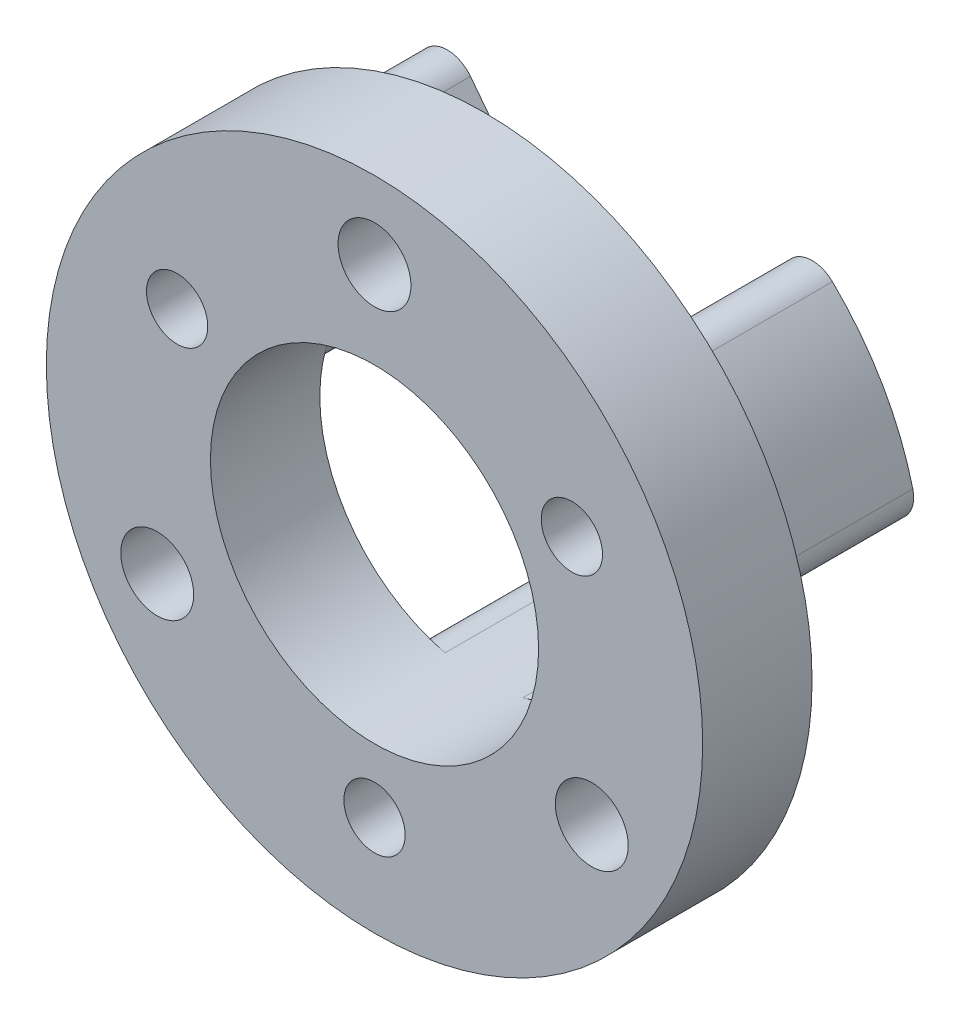
ISO-10303-21;
HEADER;
FILE_DESCRIPTION(('STEP AP214'),'2;1');
FILE_NAME('part.step','',(''),(''),'','','');
FILE_SCHEMA(('AUTOMOTIVE_DESIGN { 1 0 10303 214 1 1 1 1 }'));
ENDSEC;
DATA;
#1=APPLICATION_CONTEXT('core data for automotive mechanical design processes');
#2=APPLICATION_PROTOCOL_DEFINITION('international standard','automotive_design',2000,#1);
#3=PRODUCT_CONTEXT('',#1,'mechanical');
#4=PRODUCT('Part','Part','',(#3));
#5=PRODUCT_RELATED_PRODUCT_CATEGORY('part','',(#4));
#6=PRODUCT_DEFINITION_FORMATION('','',#4);
#7=PRODUCT_DEFINITION_CONTEXT('part definition',#1,'design');
#8=PRODUCT_DEFINITION('design','',#6,#7);
#9=PRODUCT_DEFINITION_SHAPE('','',#8);
#10=(LENGTH_UNIT() NAMED_UNIT(*) SI_UNIT(.MILLI.,.METRE.));
#11=(NAMED_UNIT(*) PLANE_ANGLE_UNIT() SI_UNIT($,.RADIAN.));
#12=(NAMED_UNIT(*) SI_UNIT($,.STERADIAN.) SOLID_ANGLE_UNIT());
#13=UNCERTAINTY_MEASURE_WITH_UNIT(LENGTH_MEASURE(1.E-05),#10,'distance_accuracy_value','');
#14=(GEOMETRIC_REPRESENTATION_CONTEXT(3) GLOBAL_UNCERTAINTY_ASSIGNED_CONTEXT((#13)) GLOBAL_UNIT_ASSIGNED_CONTEXT((#10,
#11,#12)) REPRESENTATION_CONTEXT('',''));
#15=CARTESIAN_POINT('',(0.,0.,0.));
#16=DIRECTION('',(0.,0.,1.));
#17=DIRECTION('',(1.,0.,0.));
#18=AXIS2_PLACEMENT_3D('',#15,#16,#17);
#19=CARTESIAN_POINT('',(0.,0.,10.));
#20=DIRECTION('',(0.,0.,1.));
#21=DIRECTION('',(1.,0.,0.));
#22=AXIS2_PLACEMENT_3D('',#19,#20,#21);
#23=PLANE('',#22);
#24=CARTESIAN_POINT('',(0.,0.,10.));
#25=DIRECTION('',(0.,0.,1.));
#26=DIRECTION('',(1.,0.,0.));
#27=AXIS2_PLACEMENT_3D('',#24,#25,#26);
#28=CIRCLE('',#27,22.5);
#29=CARTESIAN_POINT('',(22.5,0.,10.));
#30=VERTEX_POINT('',#29);
#31=EDGE_CURVE('E441',#30,#30,#28,.T.);
#32=ORIENTED_EDGE('',*,*,#31,.F.);
#33=EDGE_LOOP('',(#32));
#34=FACE_BOUND('',#33,.T.);
#35=CARTESIAN_POINT('',(0.,17.2,10.));
#36=DIRECTION('',(0.,0.,1.));
#37=DIRECTION('',(1.,0.,0.));
#38=AXIS2_PLACEMENT_3D('',#35,#36,#37);
#39=CIRCLE('',#38,2.5);
#40=CARTESIAN_POINT('',(2.5,17.2,10.));
#41=VERTEX_POINT('',#40);
#42=EDGE_CURVE('E429',#41,#41,#39,.T.);
#43=ORIENTED_EDGE('',*,*,#42,.T.);
#44=EDGE_LOOP('',(#43));
#45=FACE_BOUND('',#44,.T.);
#46=CARTESIAN_POINT('',(14.8956369450924,-8.6,10.));
#47=DIRECTION('',(0.,0.,1.));
#48=DIRECTION('',(1.,0.,0.));
#49=AXIS2_PLACEMENT_3D('',#46,#47,#48);
#50=CIRCLE('',#49,2.5);
#51=CARTESIAN_POINT('',(17.3956369450923,-8.6,10.));
#52=VERTEX_POINT('',#51);
#53=EDGE_CURVE('E423',#52,#52,#50,.T.);
#54=ORIENTED_EDGE('',*,*,#53,.T.);
#55=EDGE_LOOP('',(#54));
#56=FACE_BOUND('',#55,.T.);
#57=CARTESIAN_POINT('',(-14.8956369450923,-8.60000000000001,10.));
#58=DIRECTION('',(0.,0.,1.));
#59=DIRECTION('',(1.,0.,0.));
#60=AXIS2_PLACEMENT_3D('',#57,#58,#59);
#61=CIRCLE('',#60,2.5);
#62=CARTESIAN_POINT('',(-12.3956369450923,-8.60000000000001,10.));
#63=VERTEX_POINT('',#62);
#64=EDGE_CURVE('E419',#63,#63,#61,.T.);
#65=ORIENTED_EDGE('',*,*,#64,.T.);
#66=EDGE_LOOP('',(#65));
#67=FACE_BOUND('',#66,.T.);
#68=CARTESIAN_POINT('',(0.,0.,10.));
#69=DIRECTION('',(0.,0.,1.));
#70=DIRECTION('',(1.,0.,0.));
#71=AXIS2_PLACEMENT_3D('',#68,#69,#70);
#72=CIRCLE('',#71,11.25);
#73=CARTESIAN_POINT('',(-10.7975481057904,3.15839435522886,10.));
#74=VERTEX_POINT('',#73);
#75=CARTESIAN_POINT('',(-2.6635243060975,-10.9301481358135,10.));
#76=VERTEX_POINT('',#75);
#77=EDGE_CURVE('E444',#74,#76,#72,.T.);
#78=ORIENTED_EDGE('',*,*,#77,.T.);
#79=CARTESIAN_POINT('',(-3.13703973829261,-12.8732855821804,10.));
#80=DIRECTION('',(0.,0.,1.));
#81=DIRECTION('',(1.,0.,0.));
#82=AXIS2_PLACEMENT_3D('',#79,#80,#81);
#83=CIRCLE('',#82,2.);
#84=CARTESIAN_POINT('',(-4.98643947984107,-12.11189173143,10.));
#85=VERTEX_POINT('',#84);
#86=EDGE_CURVE('E12',#76,#85,#83,.T.);
#87=ORIENTED_EDGE('',*,*,#86,.T.);
#88=DIRECTION('',(-0.380696925375188,-0.924699870774231,0.));
#89=VECTOR('',#88,1.);
#90=CARTESIAN_POINT('',(0.,0.,10.));
#91=LINE('',#90,#89);
#92=CARTESIAN_POINT('',(-6.81011363171268,-16.5415341586916,10.));
#93=VERTEX_POINT('',#92);
#94=EDGE_CURVE('E358',#85,#93,#91,.T.);
#95=ORIENTED_EDGE('',*,*,#94,.T.);
#96=CARTESIAN_POINT('',(-4.96071389016422,-17.302928009442,10.));
#97=DIRECTION('',(0.,0.,1.));
#98=DIRECTION('',(1.,0.,0.));
#99=AXIS2_PLACEMENT_3D('',#96,#97,#98);
#100=CIRCLE('',#99,2.);
#101=CARTESIAN_POINT('',(-5.51190432240469,-19.2254755660466,10.));
#102=VERTEX_POINT('',#101);
#103=EDGE_CURVE('E73',#93,#102,#100,.T.);
#104=ORIENTED_EDGE('',*,*,#103,.T.);
#105=CARTESIAN_POINT('',(0.,0.,10.));
#106=DIRECTION('',(0.,0.,1.));
#107=DIRECTION('',(-0.499999999999992,-0.866025403784443,0.));
#108=AXIS2_PLACEMENT_3D('',#105,#106,#107);
#109=CIRCLE('',#108,20.);
#110=CARTESIAN_POINT('',(5.51190432240505,-19.2254755660465,10.));
#111=VERTEX_POINT('',#110);
#112=EDGE_CURVE('E356',#102,#111,#109,.T.);
#113=ORIENTED_EDGE('',*,*,#112,.T.);
#114=CARTESIAN_POINT('',(4.96071389016454,-17.3029280094419,10.));
#115=DIRECTION('',(0.,0.,1.));
#116=DIRECTION('',(1.,0.,0.));
#117=AXIS2_PLACEMENT_3D('',#114,#115,#116);
#118=CIRCLE('',#117,2.);
#119=CARTESIAN_POINT('',(6.81011363171299,-16.5415341586915,10.));
#120=VERTEX_POINT('',#119);
#121=EDGE_CURVE('E346',#111,#120,#118,.T.);
#122=ORIENTED_EDGE('',*,*,#121,.T.);
#123=DIRECTION('',(0.380696925375205,-0.924699870774223,0.));
#124=VECTOR('',#123,1.);
#125=CARTESIAN_POINT('',(0.,0.,10.));
#126=LINE('',#125,#124);
#127=CARTESIAN_POINT('',(4.9864394798413,-12.1118917314299,10.));
#128=VERTEX_POINT('',#127);
#129=EDGE_CURVE('E367',#128,#120,#126,.T.);
#130=ORIENTED_EDGE('',*,*,#129,.F.);
#131=CARTESIAN_POINT('',(3.13703973829285,-12.8732855821803,10.));
#132=DIRECTION('',(0.,0.,1.));
#133=DIRECTION('',(1.,0.,0.));
#134=AXIS2_PLACEMENT_3D('',#131,#132,#133);
#135=CIRCLE('',#134,2.);
#136=CARTESIAN_POINT('',(2.6635243060977,-10.9301481358135,10.));
#137=VERTEX_POINT('',#136);
#138=EDGE_CURVE('E349',#128,#137,#135,.T.);
#139=ORIENTED_EDGE('',*,*,#138,.T.);
#140=CARTESIAN_POINT('',(10.7975481057904,3.15839435522891,10.));
#141=VERTEX_POINT('',#140);
#142=EDGE_CURVE('E435',#137,#141,#72,.T.);
#143=ORIENTED_EDGE('',*,*,#142,.T.);
#144=CARTESIAN_POINT('',(12.7171122134865,3.71988668504738,10.));
#145=DIRECTION('',(0.,0.,1.));
#146=DIRECTION('',(1.,0.,0.));
#147=AXIS2_PLACEMENT_3D('',#144,#145,#146);
#148=CIRCLE('',#147,2.);
#149=CARTESIAN_POINT('',(12.9824256672256,1.73756260173884,10.));
#150=VERTEX_POINT('',#149);
#151=EDGE_CURVE('E255',#141,#150,#148,.T.);
#152=ORIENTED_EDGE('',*,*,#151,.T.);
#153=DIRECTION('',(0.991162041654266,0.132656726869564,0.));
#154=VECTOR('',#153,1.);
#155=CARTESIAN_POINT('',(0.,0.,10.));
#156=LINE('',#155,#154);
#157=CARTESIAN_POINT('',(17.7304456148513,2.37303567162375,10.));
#158=VERTEX_POINT('',#157);
#159=EDGE_CURVE('E251',#150,#158,#156,.T.);
#160=ORIENTED_EDGE('',*,*,#159,.T.);
#161=CARTESIAN_POINT('',(17.4651321611122,4.35535975493229,10.));
#162=DIRECTION('',(0.,0.,1.));
#163=DIRECTION('',(1.,0.,0.));
#164=AXIS2_PLACEMENT_3D('',#161,#162,#163);
#165=CIRCLE('',#164,2.);
#166=CARTESIAN_POINT('',(19.4057024012358,4.83928861659143,10.));
#167=VERTEX_POINT('',#166);
#168=EDGE_CURVE('E235',#158,#167,#165,.T.);
#169=ORIENTED_EDGE('',*,*,#168,.T.);
#170=CARTESIAN_POINT('',(0.,0.,10.));
#171=DIRECTION('',(0.,0.,1.));
#172=DIRECTION('',(1.,0.,0.));
#173=AXIS2_PLACEMENT_3D('',#170,#171,#172);
#174=CIRCLE('',#173,20.);
#175=CARTESIAN_POINT('',(13.8937980788309,14.3861869494552,10.));
#176=VERTEX_POINT('',#175);
#177=EDGE_CURVE('E245',#167,#176,#174,.T.);
#178=ORIENTED_EDGE('',*,*,#177,.T.);
#179=CARTESIAN_POINT('',(12.5044182709478,12.9475682545096,10.));
#180=DIRECTION('',(0.,0.,1.));
#181=DIRECTION('',(1.,0.,0.));
#182=AXIS2_PLACEMENT_3D('',#179,#180,#181);
#183=CIRCLE('',#182,2.);
#184=CARTESIAN_POINT('',(10.9203319831385,14.1684984870678,10.));
#185=VERTEX_POINT('',#184);
#186=EDGE_CURVE('E258',#176,#185,#183,.T.);
#187=ORIENTED_EDGE('',*,*,#186,.T.);
#188=DIRECTION('',(0.61046511627907,0.792043143904662,0.));
#189=VECTOR('',#188,1.);
#190=CARTESIAN_POINT('',(0.,0.,10.));
#191=LINE('',#190,#189);
#192=CARTESIAN_POINT('',(7.99598618738443,10.3743291296911,10.));
#193=VERTEX_POINT('',#192);
#194=EDGE_CURVE('E250',#193,#185,#191,.T.);
#195=ORIENTED_EDGE('',*,*,#194,.F.);
#196=CARTESIAN_POINT('',(9.58007247519376,9.15339889713296,10.));
#197=DIRECTION('',(0.,0.,1.));
#198=DIRECTION('',(1.,0.,0.));
#199=AXIS2_PLACEMENT_3D('',#196,#197,#198);
#200=CIRCLE('',#199,2.);
#201=CARTESIAN_POINT('',(8.13402379969281,7.77175378058459,10.));
#202=VERTEX_POINT('',#201);
#203=EDGE_CURVE('E254',#193,#202,#200,.T.);
#204=ORIENTED_EDGE('',*,*,#203,.T.);
#205=CARTESIAN_POINT('',(-8.13402379969285,7.77175378058455,10.));
#206=VERTEX_POINT('',#205);
#207=EDGE_CURVE('E442',#202,#206,#72,.T.);
#208=ORIENTED_EDGE('',*,*,#207,.T.);
#209=CARTESIAN_POINT('',(-9.5800724751938,9.15339889713292,10.));
#210=DIRECTION('',(0.,0.,1.));
#211=DIRECTION('',(1.,0.,0.));
#212=AXIS2_PLACEMENT_3D('',#209,#210,#211);
#213=CIRCLE('',#212,2.);
#214=CARTESIAN_POINT('',(-7.99598618738448,10.3743291296911,10.));
#215=VERTEX_POINT('',#214);
#216=EDGE_CURVE('E311',#206,#215,#213,.T.);
#217=ORIENTED_EDGE('',*,*,#216,.T.);
#218=DIRECTION('',(-0.610465116279074,0.79204314390466,0.));
#219=VECTOR('',#218,1.);
#220=CARTESIAN_POINT('',(0.,0.,10.));
#221=LINE('',#220,#219);
#222=CARTESIAN_POINT('',(-10.9203319831386,14.1684984870677,10.));
#223=VERTEX_POINT('',#222);
#224=EDGE_CURVE('E392',#215,#223,#221,.T.);
#225=ORIENTED_EDGE('',*,*,#224,.T.);
#226=CARTESIAN_POINT('',(-12.5044182709479,12.9475682545096,10.));
#227=DIRECTION('',(0.,0.,1.));
#228=DIRECTION('',(1.,0.,0.));
#229=AXIS2_PLACEMENT_3D('',#226,#227,#228);
#230=CIRCLE('',#229,2.);
#231=CARTESIAN_POINT('',(-13.893798078831,14.3861869494551,10.));
#232=VERTEX_POINT('',#231);
#233=EDGE_CURVE('E309',#223,#232,#230,.T.);
#234=ORIENTED_EDGE('',*,*,#233,.T.);
#235=CARTESIAN_POINT('',(0.,0.,10.));
#236=DIRECTION('',(0.,0.,1.));
#237=DIRECTION('',(-0.500000000000004,0.866025403784436,0.));
#238=AXIS2_PLACEMENT_3D('',#235,#236,#237);
#239=CIRCLE('',#238,20.);
#240=CARTESIAN_POINT('',(-19.4057024012358,4.83928861659134,10.));
#241=VERTEX_POINT('',#240);
#242=EDGE_CURVE('E395',#232,#241,#239,.T.);
#243=ORIENTED_EDGE('',*,*,#242,.T.);
#244=CARTESIAN_POINT('',(-17.4651321611122,4.35535975493221,10.));
#245=DIRECTION('',(0.,0.,1.));
#246=DIRECTION('',(1.,0.,0.));
#247=AXIS2_PLACEMENT_3D('',#244,#245,#246);
#248=CIRCLE('',#247,2.);
#249=CARTESIAN_POINT('',(-17.7304456148514,2.37303567162367,10.));
#250=VERTEX_POINT('',#249);
#251=EDGE_CURVE('E304',#241,#250,#248,.T.);
#252=ORIENTED_EDGE('',*,*,#251,.T.);
#253=DIRECTION('',(-0.991162041654267,0.13265672686956,0.));
#254=VECTOR('',#253,1.);
#255=CARTESIAN_POINT('',(0.,0.,10.));
#256=LINE('',#255,#254);
#257=CARTESIAN_POINT('',(-12.9824256672256,1.73756260173879,10.));
#258=VERTEX_POINT('',#257);
#259=EDGE_CURVE('E399',#258,#250,#256,.T.);
#260=ORIENTED_EDGE('',*,*,#259,.F.);
#261=CARTESIAN_POINT('',(-12.7171122134865,3.71988668504732,10.));
#262=DIRECTION('',(0.,0.,1.));
#263=DIRECTION('',(1.,0.,0.));
#264=AXIS2_PLACEMENT_3D('',#261,#262,#263);
#265=CIRCLE('',#264,2.);
#266=EDGE_CURVE('E306',#258,#74,#265,.T.);
#267=ORIENTED_EDGE('',*,*,#266,.T.);
#268=EDGE_LOOP('',(#78,#87,#95,#104,#113,#122,#130,#139,#143,#152,#160,#169,#178,#187,#195,#204,
#208,#217,#225,#234,#243,#252,#260,#267));
#269=FACE_BOUND('',#268,.T.);
#270=ADVANCED_FACE('F65',(#34,#45,#56,#67,#269),#23,.F.);
#271=CARTESIAN_POINT('',(0.,0.,10.));
#272=DIRECTION('',(-0.132656726869564,0.991162041654266,0.));
#273=DIRECTION('',(-0.991162041654266,-0.132656726869564,0.));
#274=AXIS2_PLACEMENT_3D('',#271,#272,#273);
#275=PLANE('',#274);
#276=DIRECTION('',(0.991162041654266,0.132656726869564,0.));
#277=VECTOR('',#276,1.);
#278=CARTESIAN_POINT('',(0.,0.,0.));
#279=LINE('',#278,#277);
#280=CARTESIAN_POINT('',(12.9824256672256,1.73756260173884,0.));
#281=VERTEX_POINT('',#280);
#282=CARTESIAN_POINT('',(17.7304456148513,2.37303567162375,0.));
#283=VERTEX_POINT('',#282);
#284=EDGE_CURVE('E449',#281,#283,#279,.T.);
#285=ORIENTED_EDGE('',*,*,#284,.T.);
#286=DIRECTION('',(0.,0.,-1.));
#287=VECTOR('',#286,1.);
#288=CARTESIAN_POINT('',(17.7304456148513,2.37303567162375,10.));
#289=LINE('',#288,#287);
#290=EDGE_CURVE('E273',#283,#158,#289,.F.);
#291=ORIENTED_EDGE('',*,*,#290,.T.);
#292=ORIENTED_EDGE('',*,*,#159,.F.);
#293=DIRECTION('',(0.,0.,1.));
#294=VECTOR('',#293,1.);
#295=CARTESIAN_POINT('',(12.9824256672256,1.73756260173884,0.));
#296=LINE('',#295,#294);
#297=EDGE_CURVE('E270',#150,#281,#296,.F.);
#298=ORIENTED_EDGE('',*,*,#297,.T.);
#299=EDGE_LOOP('',(#285,#291,#292,#298));
#300=FACE_BOUND('',#299,.T.);
#301=ADVANCED_FACE('F499',(#300),#275,.F.);
#302=CARTESIAN_POINT('',(0.,0.,10.));
#303=DIRECTION('',(0.,0.,-1.));
#304=DIRECTION('',(-1.,0.,0.));
#305=AXIS2_PLACEMENT_3D('',#302,#303,#304);
#306=CYLINDRICAL_SURFACE('',#305,20.);
#307=CARTESIAN_POINT('',(0.,0.,0.));
#308=DIRECTION('',(0.,0.,1.));
#309=DIRECTION('',(1.,0.,0.));
#310=AXIS2_PLACEMENT_3D('',#307,#308,#309);
#311=CIRCLE('',#310,20.);
#312=CARTESIAN_POINT('',(19.4057024012358,4.83928861659143,0.));
#313=VERTEX_POINT('',#312);
#314=CARTESIAN_POINT('',(13.8937980788309,14.3861869494552,0.));
#315=VERTEX_POINT('',#314);
#316=EDGE_CURVE('E458',#313,#315,#311,.T.);
#317=ORIENTED_EDGE('',*,*,#316,.T.);
#318=DIRECTION('',(0.,0.,-1.));
#319=VECTOR('',#318,1.);
#320=CARTESIAN_POINT('',(13.8937980788309,14.3861869494552,10.));
#321=LINE('',#320,#319);
#322=EDGE_CURVE('E241',#315,#176,#321,.F.);
#323=ORIENTED_EDGE('',*,*,#322,.T.);
#324=ORIENTED_EDGE('',*,*,#177,.F.);
#325=DIRECTION('',(0.,0.,-1.));
#326=VECTOR('',#325,1.);
#327=CARTESIAN_POINT('',(19.4057024012358,4.83928861659143,10.));
#328=LINE('',#327,#326);
#329=EDGE_CURVE('E230',#167,#313,#328,.T.);
#330=ORIENTED_EDGE('',*,*,#329,.T.);
#331=EDGE_LOOP('',(#317,#323,#324,#330));
#332=FACE_BOUND('',#331,.T.);
#333=ADVANCED_FACE('F246',(#332),#306,.T.);
#334=CARTESIAN_POINT('',(0.,0.,10.));
#335=DIRECTION('',(-0.792043143904662,0.61046511627907,0.));
#336=DIRECTION('',(-0.61046511627907,-0.792043143904662,0.));
#337=AXIS2_PLACEMENT_3D('',#334,#335,#336);
#338=PLANE('',#337);
#339=ORIENTED_EDGE('',*,*,#194,.T.);
#340=DIRECTION('',(0.,0.,1.));
#341=VECTOR('',#340,1.);
#342=CARTESIAN_POINT('',(10.9203319831385,14.1684984870678,0.));
#343=LINE('',#342,#341);
#344=CARTESIAN_POINT('',(10.9203319831385,14.1684984870678,0.));
#345=VERTEX_POINT('',#344);
#346=EDGE_CURVE('E466',#185,#345,#343,.F.);
#347=ORIENTED_EDGE('',*,*,#346,.T.);
#348=DIRECTION('',(0.61046511627907,0.792043143904662,0.));
#349=VECTOR('',#348,1.);
#350=CARTESIAN_POINT('',(0.,0.,0.));
#351=LINE('',#350,#349);
#352=CARTESIAN_POINT('',(7.99598618738443,10.3743291296911,0.));
#353=VERTEX_POINT('',#352);
#354=EDGE_CURVE('E460',#353,#345,#351,.T.);
#355=ORIENTED_EDGE('',*,*,#354,.F.);
#356=DIRECTION('',(0.,0.,-1.));
#357=VECTOR('',#356,1.);
#358=CARTESIAN_POINT('',(7.99598618738443,10.3743291296911,10.));
#359=LINE('',#358,#357);
#360=EDGE_CURVE('E455',#353,#193,#359,.F.);
#361=ORIENTED_EDGE('',*,*,#360,.T.);
#362=EDGE_LOOP('',(#339,#347,#355,#361));
#363=FACE_BOUND('',#362,.T.);
#364=ADVANCED_FACE('F484',(#363),#338,.T.);
#365=CARTESIAN_POINT('',(0.,0.,10.));
#366=DIRECTION('',(0.,0.,-1.));
#367=DIRECTION('',(-1.,0.,0.));
#368=AXIS2_PLACEMENT_3D('',#365,#366,#367);
#369=CYLINDRICAL_SURFACE('',#368,11.25);
#370=ORIENTED_EDGE('',*,*,#142,.F.);
#371=DIRECTION('',(0.,0.,-1.));
#372=VECTOR('',#371,1.);
#373=CARTESIAN_POINT('',(2.6635243060977,-10.9301481358135,10.));
#374=LINE('',#373,#372);
#375=CARTESIAN_POINT('',(2.6635243060977,-10.9301481358135,0.));
#376=VERTEX_POINT('',#375);
#377=EDGE_CURVE('E338',#137,#376,#374,.T.);
#378=ORIENTED_EDGE('',*,*,#377,.T.);
#379=CARTESIAN_POINT('',(0.,0.,0.));
#380=DIRECTION('',(0.,0.,1.));
#381=DIRECTION('',(-0.499999999999992,-0.866025403784443,0.));
#382=AXIS2_PLACEMENT_3D('',#379,#380,#381);
#383=CIRCLE('',#382,11.25);
#384=CARTESIAN_POINT('',(-2.6635243060975,-10.9301481358135,0.));
#385=VERTEX_POINT('',#384);
#386=EDGE_CURVE('E389',#385,#376,#383,.T.);
#387=ORIENTED_EDGE('',*,*,#386,.F.);
#388=DIRECTION('',(0.,0.,-1.));
#389=VECTOR('',#388,1.);
#390=CARTESIAN_POINT('',(-2.6635243060975,-10.9301481358135,10.));
#391=LINE('',#390,#389);
#392=EDGE_CURVE('E335',#385,#76,#391,.F.);
#393=ORIENTED_EDGE('',*,*,#392,.T.);
#394=ORIENTED_EDGE('',*,*,#77,.F.);
#395=DIRECTION('',(0.,0.,-1.));
#396=VECTOR('',#395,1.);
#397=CARTESIAN_POINT('',(-10.7975481057904,3.15839435522886,10.));
#398=LINE('',#397,#396);
#399=CARTESIAN_POINT('',(-10.7975481057904,3.15839435522886,0.));
#400=VERTEX_POINT('',#399);
#401=EDGE_CURVE('E296',#74,#400,#398,.T.);
#402=ORIENTED_EDGE('',*,*,#401,.T.);
#403=CARTESIAN_POINT('',(0.,0.,0.));
#404=DIRECTION('',(0.,0.,1.));
#405=DIRECTION('',(-0.500000000000004,0.866025403784436,0.));
#406=AXIS2_PLACEMENT_3D('',#403,#404,#405);
#407=CIRCLE('',#406,11.25);
#408=CARTESIAN_POINT('',(-8.13402379969285,7.77175378058455,0.));
#409=VERTEX_POINT('',#408);
#410=EDGE_CURVE('E396',#409,#400,#407,.T.);
#411=ORIENTED_EDGE('',*,*,#410,.F.);
#412=DIRECTION('',(0.,0.,-1.));
#413=VECTOR('',#412,1.);
#414=CARTESIAN_POINT('',(-8.13402379969285,7.77175378058455,10.));
#415=LINE('',#414,#413);
#416=EDGE_CURVE('E293',#409,#206,#415,.F.);
#417=ORIENTED_EDGE('',*,*,#416,.T.);
#418=ORIENTED_EDGE('',*,*,#207,.F.);
#419=DIRECTION('',(0.,0.,-1.));
#420=VECTOR('',#419,1.);
#421=CARTESIAN_POINT('',(8.13402379969281,7.77175378058459,10.));
#422=LINE('',#421,#420);
#423=CARTESIAN_POINT('',(8.13402379969281,7.77175378058459,0.));
#424=VERTEX_POINT('',#423);
#425=EDGE_CURVE('E267',#202,#424,#422,.T.);
#426=ORIENTED_EDGE('',*,*,#425,.T.);
#427=CARTESIAN_POINT('',(0.,0.,0.));
#428=DIRECTION('',(0.,0.,1.));
#429=DIRECTION('',(1.,0.,0.));
#430=AXIS2_PLACEMENT_3D('',#427,#428,#429);
#431=CIRCLE('',#430,11.25);
#432=CARTESIAN_POINT('',(10.7975481057904,3.15839435522891,0.));
#433=VERTEX_POINT('',#432);
#434=EDGE_CURVE('E452',#433,#424,#431,.T.);
#435=ORIENTED_EDGE('',*,*,#434,.F.);
#436=DIRECTION('',(0.,0.,-1.));
#437=VECTOR('',#436,1.);
#438=CARTESIAN_POINT('',(10.7975481057904,3.15839435522891,10.));
#439=LINE('',#438,#437);
#440=EDGE_CURVE('E264',#433,#141,#439,.F.);
#441=ORIENTED_EDGE('',*,*,#440,.T.);
#442=EDGE_LOOP('',(#370,#378,#387,#393,#394,#402,#411,#417,#418,#426,#435,#441));
#443=FACE_BOUND('',#442,.T.);
#444=CARTESIAN_POINT('',(0.,0.,17.5));
#445=DIRECTION('',(0.,0.,1.));
#446=DIRECTION('',(1.,0.,0.));
#447=AXIS2_PLACEMENT_3D('',#444,#445,#446);
#448=CIRCLE('',#447,11.25);
#449=CARTESIAN_POINT('',(11.25,0.,17.5));
#450=VERTEX_POINT('',#449);
#451=EDGE_CURVE('E438',#450,#450,#448,.T.);
#452=ORIENTED_EDGE('',*,*,#451,.T.);
#453=EDGE_LOOP('',(#452));
#454=FACE_BOUND('',#453,.T.);
#455=ADVANCED_FACE('F490',(#443,#454),#369,.F.);
#456=CARTESIAN_POINT('',(0.,0.,0.));
#457=DIRECTION('',(0.,0.,1.));
#458=DIRECTION('',(1.,0.,0.));
#459=AXIS2_PLACEMENT_3D('',#456,#457,#458);
#460=PLANE('',#459);
#461=CARTESIAN_POINT('',(13.5316469341318,7.81250000000002,0.));
#462=DIRECTION('',(0.,0.,-1.));
#463=DIRECTION('',(-1.,0.,0.));
#464=AXIS2_PLACEMENT_3D('',#461,#462,#463);
#465=CIRCLE('',#464,2.1);
#466=CARTESIAN_POINT('',(11.4316469341318,7.81250000000002,0.));
#467=VERTEX_POINT('',#466);
#468=EDGE_CURVE('E402',#467,#467,#465,.T.);
#469=ORIENTED_EDGE('',*,*,#468,.F.);
#470=EDGE_LOOP('',(#469));
#471=FACE_BOUND('',#470,.T.);
#472=ORIENTED_EDGE('',*,*,#354,.T.);
#473=CARTESIAN_POINT('',(12.5044182709478,12.9475682545096,0.));
#474=DIRECTION('',(0.,0.,1.));
#475=DIRECTION('',(1.,0.,0.));
#476=AXIS2_PLACEMENT_3D('',#473,#474,#475);
#477=CIRCLE('',#476,2.);
#478=EDGE_CURVE('E242',#345,#315,#477,.F.);
#479=ORIENTED_EDGE('',*,*,#478,.T.);
#480=ORIENTED_EDGE('',*,*,#316,.F.);
#481=CARTESIAN_POINT('',(17.4651321611122,4.35535975493229,0.));
#482=DIRECTION('',(0.,0.,1.));
#483=DIRECTION('',(1.,0.,0.));
#484=AXIS2_PLACEMENT_3D('',#481,#482,#483);
#485=CIRCLE('',#484,2.);
#486=EDGE_CURVE('E237',#313,#283,#485,.F.);
#487=ORIENTED_EDGE('',*,*,#486,.T.);
#488=ORIENTED_EDGE('',*,*,#284,.F.);
#489=CARTESIAN_POINT('',(12.7171122134865,3.71988668504738,0.));
#490=DIRECTION('',(0.,0.,1.));
#491=DIRECTION('',(1.,0.,0.));
#492=AXIS2_PLACEMENT_3D('',#489,#490,#491);
#493=CIRCLE('',#492,2.);
#494=EDGE_CURVE('E469',#281,#433,#493,.F.);
#495=ORIENTED_EDGE('',*,*,#494,.T.);
#496=ORIENTED_EDGE('',*,*,#434,.T.);
#497=CARTESIAN_POINT('',(9.58007247519376,9.15339889713296,0.));
#498=DIRECTION('',(0.,0.,1.));
#499=DIRECTION('',(1.,0.,0.));
#500=AXIS2_PLACEMENT_3D('',#497,#498,#499);
#501=CIRCLE('',#500,2.);
#502=EDGE_CURVE('E472',#424,#353,#501,.F.);
#503=ORIENTED_EDGE('',*,*,#502,.T.);
#504=EDGE_LOOP('',(#472,#479,#480,#487,#488,#495,#496,#503));
#505=FACE_BOUND('',#504,.T.);
#506=ADVANCED_FACE('F475',(#471,#505),#460,.F.);
#507=CARTESIAN_POINT('',(12.5044182709478,12.9475682545096,10.));
#508=DIRECTION('',(0.,0.,-1.));
#509=DIRECTION('',(-1.,0.,0.));
#510=AXIS2_PLACEMENT_3D('',#507,#508,#509);
#511=CYLINDRICAL_SURFACE('',#510,2.);
#512=ORIENTED_EDGE('',*,*,#186,.F.);
#513=ORIENTED_EDGE('',*,*,#322,.F.);
#514=ORIENTED_EDGE('',*,*,#478,.F.);
#515=ORIENTED_EDGE('',*,*,#346,.F.);
#516=EDGE_LOOP('',(#512,#513,#514,#515));
#517=FACE_BOUND('',#516,.T.);
#518=ADVANCED_FACE('F479',(#517),#511,.T.);
#519=CARTESIAN_POINT('',(9.58007247519376,9.15339889713296,10.));
#520=DIRECTION('',(0.,0.,-1.));
#521=DIRECTION('',(-1.,0.,0.));
#522=AXIS2_PLACEMENT_3D('',#519,#520,#521);
#523=CYLINDRICAL_SURFACE('',#522,2.);
#524=ORIENTED_EDGE('',*,*,#203,.F.);
#525=ORIENTED_EDGE('',*,*,#360,.F.);
#526=ORIENTED_EDGE('',*,*,#502,.F.);
#527=ORIENTED_EDGE('',*,*,#425,.F.);
#528=EDGE_LOOP('',(#524,#525,#526,#527));
#529=FACE_BOUND('',#528,.T.);
#530=ADVANCED_FACE('F487',(#529),#523,.T.);
#531=CARTESIAN_POINT('',(17.4651321611122,4.35535975493229,10.));
#532=DIRECTION('',(0.,0.,-1.));
#533=DIRECTION('',(-1.,0.,0.));
#534=AXIS2_PLACEMENT_3D('',#531,#532,#533);
#535=CYLINDRICAL_SURFACE('',#534,2.);
#536=ORIENTED_EDGE('',*,*,#168,.F.);
#537=ORIENTED_EDGE('',*,*,#290,.F.);
#538=ORIENTED_EDGE('',*,*,#486,.F.);
#539=ORIENTED_EDGE('',*,*,#329,.F.);
#540=EDGE_LOOP('',(#536,#537,#538,#539));
#541=FACE_BOUND('',#540,.T.);
#542=ADVANCED_FACE('F232',(#541),#535,.T.);
#543=CARTESIAN_POINT('',(12.7171122134865,3.71988668504738,10.));
#544=DIRECTION('',(0.,0.,-1.));
#545=DIRECTION('',(-1.,0.,0.));
#546=AXIS2_PLACEMENT_3D('',#543,#544,#545);
#547=CYLINDRICAL_SURFACE('',#546,2.);
#548=ORIENTED_EDGE('',*,*,#151,.F.);
#549=ORIENTED_EDGE('',*,*,#440,.F.);
#550=ORIENTED_EDGE('',*,*,#494,.F.);
#551=ORIENTED_EDGE('',*,*,#297,.F.);
#552=EDGE_LOOP('',(#548,#549,#550,#551));
#553=FACE_BOUND('',#552,.T.);
#554=ADVANCED_FACE('F497',(#553),#547,.T.);
#555=CARTESIAN_POINT('',(0.,0.,17.5));
#556=DIRECTION('',(0.,0.,1.));
#557=DIRECTION('',(1.,0.,0.));
#558=AXIS2_PLACEMENT_3D('',#555,#556,#557);
#559=PLANE('',#558);
#560=CARTESIAN_POINT('',(-13.5316469341319,7.81249999999992,17.5));
#561=DIRECTION('',(0.,0.,1.));
#562=DIRECTION('',(1.,0.,0.));
#563=AXIS2_PLACEMENT_3D('',#560,#561,#562);
#564=CIRCLE('',#563,2.1);
#565=CARTESIAN_POINT('',(-11.4316469341319,7.81249999999992,17.5));
#566=VERTEX_POINT('',#565);
#567=EDGE_CURVE('E378',#566,#566,#564,.F.);
#568=ORIENTED_EDGE('',*,*,#567,.T.);
#569=EDGE_LOOP('',(#568));
#570=FACE_BOUND('',#569,.T.);
#571=CARTESIAN_POINT('',(1.63931368479808E-13,-15.625,17.5));
#572=DIRECTION('',(0.,0.,1.));
#573=DIRECTION('',(1.,0.,0.));
#574=AXIS2_PLACEMENT_3D('',#571,#572,#573);
#575=CIRCLE('',#574,2.1);
#576=CARTESIAN_POINT('',(2.10000000000016,-15.625,17.5));
#577=VERTEX_POINT('',#576);
#578=EDGE_CURVE('E570',#577,#577,#575,.F.);
#579=ORIENTED_EDGE('',*,*,#578,.T.);
#580=EDGE_LOOP('',(#579));
#581=FACE_BOUND('',#580,.T.);
#582=CARTESIAN_POINT('',(13.5316469341318,7.81250000000002,17.5));
#583=DIRECTION('',(0.,0.,1.));
#584=DIRECTION('',(1.,0.,0.));
#585=AXIS2_PLACEMENT_3D('',#582,#583,#584);
#586=CIRCLE('',#585,2.1);
#587=CARTESIAN_POINT('',(15.6316469341318,7.81250000000002,17.5));
#588=VERTEX_POINT('',#587);
#589=EDGE_CURVE('E416',#588,#588,#586,.F.);
#590=ORIENTED_EDGE('',*,*,#589,.T.);
#591=EDGE_LOOP('',(#590));
#592=FACE_BOUND('',#591,.T.);
#593=CARTESIAN_POINT('',(14.8956369450924,-8.6,17.5));
#594=DIRECTION('',(0.,0.,1.));
#595=DIRECTION('',(1.,0.,0.));
#596=AXIS2_PLACEMENT_3D('',#593,#594,#595);
#597=CIRCLE('',#596,2.5);
#598=CARTESIAN_POINT('',(17.3956369450923,-8.6,17.5));
#599=VERTEX_POINT('',#598);
#600=EDGE_CURVE('E426',#599,#599,#597,.T.);
#601=ORIENTED_EDGE('',*,*,#600,.F.);
#602=EDGE_LOOP('',(#601));
#603=FACE_BOUND('',#602,.T.);
#604=ORIENTED_EDGE('',*,*,#451,.F.);
#605=EDGE_LOOP('',(#604));
#606=FACE_BOUND('',#605,.T.);
#607=CARTESIAN_POINT('',(0.,0.,17.5));
#608=DIRECTION('',(0.,0.,1.));
#609=DIRECTION('',(1.,0.,0.));
#610=AXIS2_PLACEMENT_3D('',#607,#608,#609);
#611=CIRCLE('',#610,22.5);
#612=CARTESIAN_POINT('',(22.5,0.,17.5));
#613=VERTEX_POINT('',#612);
#614=EDGE_CURVE('E445',#613,#613,#611,.T.);
#615=ORIENTED_EDGE('',*,*,#614,.T.);
#616=EDGE_LOOP('',(#615));
#617=FACE_BOUND('',#616,.T.);
#618=CARTESIAN_POINT('',(0.,17.2,17.5));
#619=DIRECTION('',(0.,0.,1.));
#620=DIRECTION('',(1.,0.,0.));
#621=AXIS2_PLACEMENT_3D('',#618,#619,#620);
#622=CIRCLE('',#621,2.5);
#623=CARTESIAN_POINT('',(2.5,17.2,17.5));
#624=VERTEX_POINT('',#623);
#625=EDGE_CURVE('E432',#624,#624,#622,.T.);
#626=ORIENTED_EDGE('',*,*,#625,.F.);
#627=EDGE_LOOP('',(#626));
#628=FACE_BOUND('',#627,.T.);
#629=CARTESIAN_POINT('',(-14.8956369450923,-8.60000000000001,17.5));
#630=DIRECTION('',(0.,0.,1.));
#631=DIRECTION('',(1.,0.,0.));
#632=AXIS2_PLACEMENT_3D('',#629,#630,#631);
#633=CIRCLE('',#632,2.5);
#634=CARTESIAN_POINT('',(-12.3956369450923,-8.60000000000001,17.5));
#635=VERTEX_POINT('',#634);
#636=EDGE_CURVE('E420',#635,#635,#633,.T.);
#637=ORIENTED_EDGE('',*,*,#636,.F.);
#638=EDGE_LOOP('',(#637));
#639=FACE_BOUND('',#638,.T.);
#640=ADVANCED_FACE('F519',(#570,#581,#592,#603,#606,#617,#628,#639),#559,.T.);
#641=CARTESIAN_POINT('',(0.,0.,17.5));
#642=DIRECTION('',(0.,0.,-1.));
#643=DIRECTION('',(-1.,0.,0.));
#644=AXIS2_PLACEMENT_3D('',#641,#642,#643);
#645=CYLINDRICAL_SURFACE('',#644,22.5);
#646=ORIENTED_EDGE('',*,*,#614,.F.);
#647=EDGE_LOOP('',(#646));
#648=FACE_BOUND('',#647,.T.);
#649=ORIENTED_EDGE('',*,*,#31,.T.);
#650=EDGE_LOOP('',(#649));
#651=FACE_BOUND('',#650,.T.);
#652=ADVANCED_FACE('F635',(#648,#651),#645,.T.);
#653=CARTESIAN_POINT('',(0.,17.2,17.5));
#654=DIRECTION('',(0.,0.,-1.));
#655=DIRECTION('',(-1.,0.,0.));
#656=AXIS2_PLACEMENT_3D('',#653,#654,#655);
#657=CYLINDRICAL_SURFACE('',#656,2.5);
#658=ORIENTED_EDGE('',*,*,#625,.T.);
#659=EDGE_LOOP('',(#658));
#660=FACE_BOUND('',#659,.T.);
#661=ORIENTED_EDGE('',*,*,#42,.F.);
#662=EDGE_LOOP('',(#661));
#663=FACE_BOUND('',#662,.T.);
#664=ADVANCED_FACE('F631',(#660,#663),#657,.F.);
#665=CARTESIAN_POINT('',(14.8956369450924,-8.6,17.5));
#666=DIRECTION('',(0.,0.,-1.));
#667=DIRECTION('',(-1.,0.,0.));
#668=AXIS2_PLACEMENT_3D('',#665,#666,#667);
#669=CYLINDRICAL_SURFACE('',#668,2.5);
#670=ORIENTED_EDGE('',*,*,#600,.T.);
#671=EDGE_LOOP('',(#670));
#672=FACE_BOUND('',#671,.T.);
#673=ORIENTED_EDGE('',*,*,#53,.F.);
#674=EDGE_LOOP('',(#673));
#675=FACE_BOUND('',#674,.T.);
#676=ADVANCED_FACE('F627',(#672,#675),#669,.F.);
#677=CARTESIAN_POINT('',(-14.8956369450923,-8.60000000000001,17.5));
#678=DIRECTION('',(0.,0.,-1.));
#679=DIRECTION('',(-1.,0.,0.));
#680=AXIS2_PLACEMENT_3D('',#677,#678,#679);
#681=CYLINDRICAL_SURFACE('',#680,2.5);
#682=ORIENTED_EDGE('',*,*,#636,.T.);
#683=EDGE_LOOP('',(#682));
#684=FACE_BOUND('',#683,.T.);
#685=ORIENTED_EDGE('',*,*,#64,.F.);
#686=EDGE_LOOP('',(#685));
#687=FACE_BOUND('',#686,.T.);
#688=ADVANCED_FACE('F620',(#684,#687),#681,.F.);
#689=CARTESIAN_POINT('',(13.5316469341318,7.81250000000002,23.439696961967));
#690=DIRECTION('',(0.,0.,-1.));
#691=DIRECTION('',(-1.,0.,0.));
#692=AXIS2_PLACEMENT_3D('',#689,#690,#691);
#693=CYLINDRICAL_SURFACE('',#692,2.1);
#694=ORIENTED_EDGE('',*,*,#468,.T.);
#695=EDGE_LOOP('',(#694));
#696=FACE_BOUND('',#695,.T.);
#697=ORIENTED_EDGE('',*,*,#589,.F.);
#698=EDGE_LOOP('',(#697));
#699=FACE_BOUND('',#698,.T.);
#700=ADVANCED_FACE('F613',(#696,#699),#693,.F.);
#701=CARTESIAN_POINT('',(0.,0.,10.));
#702=DIRECTION('',(-0.79204314390466,-0.610465116279073,0.));
#703=DIRECTION('',(0.610465116279073,-0.79204314390466,0.));
#704=AXIS2_PLACEMENT_3D('',#701,#702,#703);
#705=PLANE('',#704);
#706=DIRECTION('',(-0.610465116279074,0.79204314390466,0.));
#707=VECTOR('',#706,1.);
#708=CARTESIAN_POINT('',(0.,0.,0.));
#709=LINE('',#708,#707);
#710=CARTESIAN_POINT('',(-7.99598618738448,10.3743291296911,0.));
#711=VERTEX_POINT('',#710);
#712=CARTESIAN_POINT('',(-10.9203319831386,14.1684984870677,0.));
#713=VERTEX_POINT('',#712);
#714=EDGE_CURVE('E403',#711,#713,#709,.T.);
#715=ORIENTED_EDGE('',*,*,#714,.T.);
#716=DIRECTION('',(0.,0.,-1.));
#717=VECTOR('',#716,1.);
#718=CARTESIAN_POINT('',(-10.9203319831386,14.1684984870677,10.));
#719=LINE('',#718,#717);
#720=EDGE_CURVE('E302',#713,#223,#719,.F.);
#721=ORIENTED_EDGE('',*,*,#720,.T.);
#722=ORIENTED_EDGE('',*,*,#224,.F.);
#723=DIRECTION('',(0.,0.,1.));
#724=VECTOR('',#723,1.);
#725=CARTESIAN_POINT('',(-7.99598618738448,10.3743291296911,0.));
#726=LINE('',#725,#724);
#727=EDGE_CURVE('E299',#215,#711,#726,.F.);
#728=ORIENTED_EDGE('',*,*,#727,.T.);
#729=EDGE_LOOP('',(#715,#721,#722,#728));
#730=FACE_BOUND('',#729,.T.);
#731=ADVANCED_FACE('F607',(#730),#705,.F.);
#732=CARTESIAN_POINT('',(0.,0.,10.));
#733=DIRECTION('',(0.,0.,-1.));
#734=DIRECTION('',(-1.,0.,0.));
#735=AXIS2_PLACEMENT_3D('',#732,#733,#734);
#736=CYLINDRICAL_SURFACE('',#735,20.);
#737=CARTESIAN_POINT('',(0.,0.,0.));
#738=DIRECTION('',(0.,0.,1.));
#739=DIRECTION('',(-0.500000000000004,0.866025403784436,0.));
#740=AXIS2_PLACEMENT_3D('',#737,#738,#739);
#741=CIRCLE('',#740,20.);
#742=CARTESIAN_POINT('',(-13.893798078831,14.3861869494551,0.));
#743=VERTEX_POINT('',#742);
#744=CARTESIAN_POINT('',(-19.4057024012358,4.83928861659134,0.));
#745=VERTEX_POINT('',#744);
#746=EDGE_CURVE('E406',#743,#745,#741,.T.);
#747=ORIENTED_EDGE('',*,*,#746,.T.);
#748=DIRECTION('',(0.,0.,-1.));
#749=VECTOR('',#748,1.);
#750=CARTESIAN_POINT('',(-19.4057024012358,4.83928861659134,10.));
#751=LINE('',#750,#749);
#752=EDGE_CURVE('E291',#745,#241,#751,.F.);
#753=ORIENTED_EDGE('',*,*,#752,.T.);
#754=ORIENTED_EDGE('',*,*,#242,.F.);
#755=DIRECTION('',(0.,0.,-1.));
#756=VECTOR('',#755,1.);
#757=CARTESIAN_POINT('',(-13.893798078831,14.3861869494551,10.));
#758=LINE('',#757,#756);
#759=EDGE_CURVE('E288',#232,#743,#758,.T.);
#760=ORIENTED_EDGE('',*,*,#759,.T.);
#761=EDGE_LOOP('',(#747,#753,#754,#760));
#762=FACE_BOUND('',#761,.T.);
#763=ADVANCED_FACE('F600',(#762),#736,.T.);
#764=CARTESIAN_POINT('',(0.,0.,10.));
#765=DIRECTION('',(-0.13265672686956,-0.991162041654267,0.));
#766=DIRECTION('',(0.991162041654267,-0.13265672686956,0.));
#767=AXIS2_PLACEMENT_3D('',#764,#765,#766);
#768=PLANE('',#767);
#769=ORIENTED_EDGE('',*,*,#259,.T.);
#770=DIRECTION('',(0.,0.,1.));
#771=VECTOR('',#770,1.);
#772=CARTESIAN_POINT('',(-17.7304456148514,2.37303567162367,0.));
#773=LINE('',#772,#771);
#774=CARTESIAN_POINT('',(-17.7304456148514,2.37303567162367,0.));
#775=VERTEX_POINT('',#774);
#776=EDGE_CURVE('E277',#250,#775,#773,.F.);
#777=ORIENTED_EDGE('',*,*,#776,.T.);
#778=DIRECTION('',(-0.991162041654267,0.13265672686956,0.));
#779=VECTOR('',#778,1.);
#780=CARTESIAN_POINT('',(0.,0.,0.));
#781=LINE('',#780,#779);
#782=CARTESIAN_POINT('',(-12.9824256672256,1.73756260173879,0.));
#783=VERTEX_POINT('',#782);
#784=EDGE_CURVE('E409',#783,#775,#781,.T.);
#785=ORIENTED_EDGE('',*,*,#784,.F.);
#786=DIRECTION('',(0.,0.,-1.));
#787=VECTOR('',#786,1.);
#788=CARTESIAN_POINT('',(-12.9824256672256,1.73756260173879,10.));
#789=LINE('',#788,#787);
#790=EDGE_CURVE('E275',#783,#258,#789,.F.);
#791=ORIENTED_EDGE('',*,*,#790,.T.);
#792=EDGE_LOOP('',(#769,#777,#785,#791));
#793=FACE_BOUND('',#792,.T.);
#794=ADVANCED_FACE('F586',(#793),#768,.T.);
#795=CARTESIAN_POINT('',(0.,0.,0.));
#796=DIRECTION('',(0.,0.,1.));
#797=DIRECTION('',(-0.500000000000004,0.866025403784436,0.));
#798=AXIS2_PLACEMENT_3D('',#795,#796,#797);
#799=PLANE('',#798);
#800=CARTESIAN_POINT('',(-13.5316469341319,7.81249999999992,0.));
#801=DIRECTION('',(0.,0.,-1.));
#802=DIRECTION('',(0.500000000000004,-0.866025403784436,0.));
#803=AXIS2_PLACEMENT_3D('',#800,#801,#802);
#804=CIRCLE('',#803,2.1);
#805=CARTESIAN_POINT('',(-12.4816469341319,5.99384665205261,0.));
#806=VERTEX_POINT('',#805);
#807=EDGE_CURVE('E384',#806,#806,#804,.T.);
#808=ORIENTED_EDGE('',*,*,#807,.F.);
#809=EDGE_LOOP('',(#808));
#810=FACE_BOUND('',#809,.T.);
#811=ORIENTED_EDGE('',*,*,#784,.T.);
#812=CARTESIAN_POINT('',(-17.4651321611122,4.35535975493221,0.));
#813=DIRECTION('',(0.,0.,1.));
#814=DIRECTION('',(1.,0.,0.));
#815=AXIS2_PLACEMENT_3D('',#812,#813,#814);
#816=CIRCLE('',#815,2.);
#817=EDGE_CURVE('E286',#775,#745,#816,.F.);
#818=ORIENTED_EDGE('',*,*,#817,.T.);
#819=ORIENTED_EDGE('',*,*,#746,.F.);
#820=CARTESIAN_POINT('',(-12.5044182709479,12.9475682545096,0.));
#821=DIRECTION('',(0.,0.,1.));
#822=DIRECTION('',(1.,0.,0.));
#823=AXIS2_PLACEMENT_3D('',#820,#821,#822);
#824=CIRCLE('',#823,2.);
#825=EDGE_CURVE('E282',#743,#713,#824,.F.);
#826=ORIENTED_EDGE('',*,*,#825,.T.);
#827=ORIENTED_EDGE('',*,*,#714,.F.);
#828=CARTESIAN_POINT('',(-9.5800724751938,9.15339889713292,0.));
#829=DIRECTION('',(0.,0.,1.));
#830=DIRECTION('',(1.,0.,0.));
#831=AXIS2_PLACEMENT_3D('',#828,#829,#830);
#832=CIRCLE('',#831,2.);
#833=EDGE_CURVE('E280',#711,#409,#832,.F.);
#834=ORIENTED_EDGE('',*,*,#833,.T.);
#835=ORIENTED_EDGE('',*,*,#410,.T.);
#836=CARTESIAN_POINT('',(-12.7171122134865,3.71988668504732,0.));
#837=DIRECTION('',(0.,0.,1.));
#838=DIRECTION('',(1.,0.,0.));
#839=AXIS2_PLACEMENT_3D('',#836,#837,#838);
#840=CIRCLE('',#839,2.);
#841=EDGE_CURVE('E284',#400,#783,#840,.F.);
#842=ORIENTED_EDGE('',*,*,#841,.T.);
#843=EDGE_LOOP('',(#811,#818,#819,#826,#827,#834,#835,#842));
#844=FACE_BOUND('',#843,.T.);
#845=ADVANCED_FACE('F583',(#810,#844),#799,.F.);
#846=CARTESIAN_POINT('',(0.,0.,10.));
#847=DIRECTION('',(0.924699870774231,-0.380696925375188,0.));
#848=DIRECTION('',(0.380696925375188,0.924699870774231,0.));
#849=AXIS2_PLACEMENT_3D('',#846,#847,#848);
#850=PLANE('',#849);
#851=DIRECTION('',(-0.380696925375188,-0.924699870774231,0.));
#852=VECTOR('',#851,1.);
#853=CARTESIAN_POINT('',(0.,0.,0.));
#854=LINE('',#853,#852);
#855=CARTESIAN_POINT('',(-4.98643947984107,-12.11189173143,0.));
#856=VERTEX_POINT('',#855);
#857=CARTESIAN_POINT('',(-6.81011363171268,-16.5415341586916,0.));
#858=VERTEX_POINT('',#857);
#859=EDGE_CURVE('E374',#856,#858,#854,.T.);
#860=ORIENTED_EDGE('',*,*,#859,.T.);
#861=DIRECTION('',(0.,0.,-1.));
#862=VECTOR('',#861,1.);
#863=CARTESIAN_POINT('',(-6.81011363171268,-16.5415341586916,10.));
#864=LINE('',#863,#862);
#865=EDGE_CURVE('E82',#858,#93,#864,.F.);
#866=ORIENTED_EDGE('',*,*,#865,.T.);
#867=ORIENTED_EDGE('',*,*,#94,.F.);
#868=DIRECTION('',(0.,0.,1.));
#869=VECTOR('',#868,1.);
#870=CARTESIAN_POINT('',(-4.98643947984107,-12.11189173143,0.));
#871=LINE('',#870,#869);
#872=EDGE_CURVE('E341',#85,#856,#871,.F.);
#873=ORIENTED_EDGE('',*,*,#872,.T.);
#874=EDGE_LOOP('',(#860,#866,#867,#873));
#875=FACE_BOUND('',#874,.T.);
#876=ADVANCED_FACE('F376',(#875),#850,.F.);
#877=CARTESIAN_POINT('',(0.,0.,10.));
#878=DIRECTION('',(0.,0.,-1.));
#879=DIRECTION('',(-1.,0.,0.));
#880=AXIS2_PLACEMENT_3D('',#877,#878,#879);
#881=CYLINDRICAL_SURFACE('',#880,20.);
#882=CARTESIAN_POINT('',(0.,0.,0.));
#883=DIRECTION('',(0.,0.,1.));
#884=DIRECTION('',(-0.499999999999992,-0.866025403784443,0.));
#885=AXIS2_PLACEMENT_3D('',#882,#883,#884);
#886=CIRCLE('',#885,20.);
#887=CARTESIAN_POINT('',(-5.51190432240469,-19.2254755660466,0.));
#888=VERTEX_POINT('',#887);
#889=CARTESIAN_POINT('',(5.51190432240505,-19.2254755660465,0.));
#890=VERTEX_POINT('',#889);
#891=EDGE_CURVE('E375',#888,#890,#886,.T.);
#892=ORIENTED_EDGE('',*,*,#891,.T.);
#893=DIRECTION('',(0.,0.,-1.));
#894=VECTOR('',#893,1.);
#895=CARTESIAN_POINT('',(5.51190432240505,-19.2254755660465,10.));
#896=LINE('',#895,#894);
#897=EDGE_CURVE('E332',#890,#111,#896,.F.);
#898=ORIENTED_EDGE('',*,*,#897,.T.);
#899=ORIENTED_EDGE('',*,*,#112,.F.);
#900=DIRECTION('',(0.,0.,-1.));
#901=VECTOR('',#900,1.);
#902=CARTESIAN_POINT('',(-5.51190432240469,-19.2254755660466,10.));
#903=LINE('',#902,#901);
#904=EDGE_CURVE('E328',#102,#888,#903,.T.);
#905=ORIENTED_EDGE('',*,*,#904,.T.);
#906=EDGE_LOOP('',(#892,#898,#899,#905));
#907=FACE_BOUND('',#906,.T.);
#908=ADVANCED_FACE('F363',(#907),#881,.T.);
#909=CARTESIAN_POINT('',(0.,0.,10.));
#910=DIRECTION('',(0.924699870774223,0.380696925375205,0.));
#911=DIRECTION('',(-0.380696925375205,0.924699870774223,0.));
#912=AXIS2_PLACEMENT_3D('',#909,#910,#911);
#913=PLANE('',#912);
#914=ORIENTED_EDGE('',*,*,#129,.T.);
#915=DIRECTION('',(0.,0.,1.));
#916=VECTOR('',#915,1.);
#917=CARTESIAN_POINT('',(6.81011363171299,-16.5415341586915,0.));
#918=LINE('',#917,#916);
#919=CARTESIAN_POINT('',(6.81011363171299,-16.5415341586915,0.));
#920=VERTEX_POINT('',#919);
#921=EDGE_CURVE('E315',#120,#920,#918,.F.);
#922=ORIENTED_EDGE('',*,*,#921,.T.);
#923=DIRECTION('',(0.380696925375205,-0.924699870774223,0.));
#924=VECTOR('',#923,1.);
#925=CARTESIAN_POINT('',(0.,0.,0.));
#926=LINE('',#925,#924);
#927=CARTESIAN_POINT('',(4.9864394798413,-12.1118917314299,0.));
#928=VERTEX_POINT('',#927);
#929=EDGE_CURVE('E381',#928,#920,#926,.T.);
#930=ORIENTED_EDGE('',*,*,#929,.F.);
#931=DIRECTION('',(0.,0.,-1.));
#932=VECTOR('',#931,1.);
#933=CARTESIAN_POINT('',(4.9864394798413,-12.1118917314299,10.));
#934=LINE('',#933,#932);
#935=EDGE_CURVE('E313',#928,#128,#934,.F.);
#936=ORIENTED_EDGE('',*,*,#935,.T.);
#937=EDGE_LOOP('',(#914,#922,#930,#936));
#938=FACE_BOUND('',#937,.T.);
#939=ADVANCED_FACE('F563',(#938),#913,.T.);
#940=CARTESIAN_POINT('',(0.,0.,0.));
#941=DIRECTION('',(0.,0.,1.));
#942=DIRECTION('',(-0.499999999999992,-0.866025403784443,0.));
#943=AXIS2_PLACEMENT_3D('',#940,#941,#942);
#944=PLANE('',#943);
#945=CARTESIAN_POINT('',(1.63931368479808E-13,-15.625,0.));
#946=DIRECTION('',(0.,0.,-1.));
#947=DIRECTION('',(0.499999999999992,0.866025403784443,0.));
#948=AXIS2_PLACEMENT_3D('',#945,#946,#947);
#949=CIRCLE('',#948,2.1);
#950=CARTESIAN_POINT('',(1.05000000000015,-13.8063466520527,0.));
#951=VERTEX_POINT('',#950);
#952=EDGE_CURVE('E568',#951,#951,#949,.T.);
#953=ORIENTED_EDGE('',*,*,#952,.F.);
#954=EDGE_LOOP('',(#953));
#955=FACE_BOUND('',#954,.T.);
#956=ORIENTED_EDGE('',*,*,#929,.T.);
#957=CARTESIAN_POINT('',(4.96071389016454,-17.3029280094419,0.));
#958=DIRECTION('',(0.,0.,1.));
#959=DIRECTION('',(1.,0.,0.));
#960=AXIS2_PLACEMENT_3D('',#957,#958,#959);
#961=CIRCLE('',#960,2.);
#962=EDGE_CURVE('E326',#920,#890,#961,.F.);
#963=ORIENTED_EDGE('',*,*,#962,.T.);
#964=ORIENTED_EDGE('',*,*,#891,.F.);
#965=CARTESIAN_POINT('',(-4.96071389016422,-17.302928009442,0.));
#966=DIRECTION('',(0.,0.,1.));
#967=DIRECTION('',(1.,0.,0.));
#968=AXIS2_PLACEMENT_3D('',#965,#966,#967);
#969=CIRCLE('',#968,2.);
#970=EDGE_CURVE('E321',#888,#858,#969,.F.);
#971=ORIENTED_EDGE('',*,*,#970,.T.);
#972=ORIENTED_EDGE('',*,*,#859,.F.);
#973=CARTESIAN_POINT('',(-3.13703973829261,-12.8732855821804,0.));
#974=DIRECTION('',(0.,0.,1.));
#975=DIRECTION('',(1.,0.,0.));
#976=AXIS2_PLACEMENT_3D('',#973,#974,#975);
#977=CIRCLE('',#976,2.);
#978=EDGE_CURVE('E319',#856,#385,#977,.F.);
#979=ORIENTED_EDGE('',*,*,#978,.T.);
#980=ORIENTED_EDGE('',*,*,#386,.T.);
#981=CARTESIAN_POINT('',(3.13703973829285,-12.8732855821803,0.));
#982=DIRECTION('',(0.,0.,1.));
#983=DIRECTION('',(1.,0.,0.));
#984=AXIS2_PLACEMENT_3D('',#981,#982,#983);
#985=CIRCLE('',#984,2.);
#986=EDGE_CURVE('E324',#376,#928,#985,.F.);
#987=ORIENTED_EDGE('',*,*,#986,.T.);
#988=EDGE_LOOP('',(#956,#963,#964,#971,#972,#979,#980,#987));
#989=FACE_BOUND('',#988,.T.);
#990=ADVANCED_FACE('F373',(#955,#989),#944,.F.);
#991=CARTESIAN_POINT('',(-17.4651321611122,4.35535975493221,10.));
#992=DIRECTION('',(0.,0.,-1.));
#993=DIRECTION('',(-1.,0.,0.));
#994=AXIS2_PLACEMENT_3D('',#991,#992,#993);
#995=CYLINDRICAL_SURFACE('',#994,2.);
#996=ORIENTED_EDGE('',*,*,#251,.F.);
#997=ORIENTED_EDGE('',*,*,#752,.F.);
#998=ORIENTED_EDGE('',*,*,#817,.F.);
#999=ORIENTED_EDGE('',*,*,#776,.F.);
#1000=EDGE_LOOP('',(#996,#997,#998,#999));
#1001=FACE_BOUND('',#1000,.T.);
#1002=ADVANCED_FACE('F520',(#1001),#995,.T.);
#1003=CARTESIAN_POINT('',(-12.7171122134865,3.71988668504732,10.));
#1004=DIRECTION('',(0.,0.,-1.));
#1005=DIRECTION('',(-1.,0.,0.));
#1006=AXIS2_PLACEMENT_3D('',#1003,#1004,#1005);
#1007=CYLINDRICAL_SURFACE('',#1006,2.);
#1008=ORIENTED_EDGE('',*,*,#266,.F.);
#1009=ORIENTED_EDGE('',*,*,#790,.F.);
#1010=ORIENTED_EDGE('',*,*,#841,.F.);
#1011=ORIENTED_EDGE('',*,*,#401,.F.);
#1012=EDGE_LOOP('',(#1008,#1009,#1010,#1011));
#1013=FACE_BOUND('',#1012,.T.);
#1014=ADVANCED_FACE('F523',(#1013),#1007,.T.);
#1015=CARTESIAN_POINT('',(-12.5044182709479,12.9475682545096,10.));
#1016=DIRECTION('',(0.,0.,-1.));
#1017=DIRECTION('',(-1.,0.,0.));
#1018=AXIS2_PLACEMENT_3D('',#1015,#1016,#1017);
#1019=CYLINDRICAL_SURFACE('',#1018,2.);
#1020=ORIENTED_EDGE('',*,*,#233,.F.);
#1021=ORIENTED_EDGE('',*,*,#720,.F.);
#1022=ORIENTED_EDGE('',*,*,#825,.F.);
#1023=ORIENTED_EDGE('',*,*,#759,.F.);
#1024=EDGE_LOOP('',(#1020,#1021,#1022,#1023));
#1025=FACE_BOUND('',#1024,.T.);
#1026=ADVANCED_FACE('F527',(#1025),#1019,.T.);
#1027=CARTESIAN_POINT('',(-9.5800724751938,9.15339889713292,10.));
#1028=DIRECTION('',(0.,0.,-1.));
#1029=DIRECTION('',(-1.,0.,0.));
#1030=AXIS2_PLACEMENT_3D('',#1027,#1028,#1029);
#1031=CYLINDRICAL_SURFACE('',#1030,2.);
#1032=ORIENTED_EDGE('',*,*,#216,.F.);
#1033=ORIENTED_EDGE('',*,*,#416,.F.);
#1034=ORIENTED_EDGE('',*,*,#833,.F.);
#1035=ORIENTED_EDGE('',*,*,#727,.F.);
#1036=EDGE_LOOP('',(#1032,#1033,#1034,#1035));
#1037=FACE_BOUND('',#1036,.T.);
#1038=ADVANCED_FACE('F531',(#1037),#1031,.T.);
#1039=CARTESIAN_POINT('',(4.96071389016454,-17.3029280094419,10.));
#1040=DIRECTION('',(0.,0.,-1.));
#1041=DIRECTION('',(-1.,0.,0.));
#1042=AXIS2_PLACEMENT_3D('',#1039,#1040,#1041);
#1043=CYLINDRICAL_SURFACE('',#1042,2.);
#1044=ORIENTED_EDGE('',*,*,#121,.F.);
#1045=ORIENTED_EDGE('',*,*,#897,.F.);
#1046=ORIENTED_EDGE('',*,*,#962,.F.);
#1047=ORIENTED_EDGE('',*,*,#921,.F.);
#1048=EDGE_LOOP('',(#1044,#1045,#1046,#1047));
#1049=FACE_BOUND('',#1048,.T.);
#1050=ADVANCED_FACE('F535',(#1049),#1043,.T.);
#1051=CARTESIAN_POINT('',(3.13703973829285,-12.8732855821803,10.));
#1052=DIRECTION('',(0.,0.,-1.));
#1053=DIRECTION('',(-1.,0.,0.));
#1054=AXIS2_PLACEMENT_3D('',#1051,#1052,#1053);
#1055=CYLINDRICAL_SURFACE('',#1054,2.);
#1056=ORIENTED_EDGE('',*,*,#138,.F.);
#1057=ORIENTED_EDGE('',*,*,#935,.F.);
#1058=ORIENTED_EDGE('',*,*,#986,.F.);
#1059=ORIENTED_EDGE('',*,*,#377,.F.);
#1060=EDGE_LOOP('',(#1056,#1057,#1058,#1059));
#1061=FACE_BOUND('',#1060,.T.);
#1062=ADVANCED_FACE('F539',(#1061),#1055,.T.);
#1063=CARTESIAN_POINT('',(-4.96071389016422,-17.302928009442,10.));
#1064=DIRECTION('',(0.,0.,-1.));
#1065=DIRECTION('',(-1.,0.,0.));
#1066=AXIS2_PLACEMENT_3D('',#1063,#1064,#1065);
#1067=CYLINDRICAL_SURFACE('',#1066,2.);
#1068=ORIENTED_EDGE('',*,*,#103,.F.);
#1069=ORIENTED_EDGE('',*,*,#865,.F.);
#1070=ORIENTED_EDGE('',*,*,#970,.F.);
#1071=ORIENTED_EDGE('',*,*,#904,.F.);
#1072=EDGE_LOOP('',(#1068,#1069,#1070,#1071));
#1073=FACE_BOUND('',#1072,.T.);
#1074=ADVANCED_FACE('F369',(#1073),#1067,.T.);
#1075=CARTESIAN_POINT('',(-3.13703973829261,-12.8732855821804,10.));
#1076=DIRECTION('',(0.,0.,-1.));
#1077=DIRECTION('',(-1.,0.,0.));
#1078=AXIS2_PLACEMENT_3D('',#1075,#1076,#1077);
#1079=CYLINDRICAL_SURFACE('',#1078,2.);
#1080=ORIENTED_EDGE('',*,*,#86,.F.);
#1081=ORIENTED_EDGE('',*,*,#392,.F.);
#1082=ORIENTED_EDGE('',*,*,#978,.F.);
#1083=ORIENTED_EDGE('',*,*,#872,.F.);
#1084=EDGE_LOOP('',(#1080,#1081,#1082,#1083));
#1085=FACE_BOUND('',#1084,.T.);
#1086=ADVANCED_FACE('F67',(#1085),#1079,.T.);
#1087=CARTESIAN_POINT('',(1.63931368479808E-13,-15.625,23.439696961967));
#1088=DIRECTION('',(0.,0.,-1.));
#1089=DIRECTION('',(-1.,0.,0.));
#1090=AXIS2_PLACEMENT_3D('',#1087,#1088,#1089);
#1091=CYLINDRICAL_SURFACE('',#1090,2.1);
#1092=ORIENTED_EDGE('',*,*,#952,.T.);
#1093=EDGE_LOOP('',(#1092));
#1094=FACE_BOUND('',#1093,.T.);
#1095=ORIENTED_EDGE('',*,*,#578,.F.);
#1096=EDGE_LOOP('',(#1095));
#1097=FACE_BOUND('',#1096,.T.);
#1098=ADVANCED_FACE('F547',(#1094,#1097),#1091,.F.);
#1099=CARTESIAN_POINT('',(-13.5316469341319,7.81249999999992,23.439696961967));
#1100=DIRECTION('',(0.,0.,-1.));
#1101=DIRECTION('',(-1.,0.,0.));
#1102=AXIS2_PLACEMENT_3D('',#1099,#1100,#1101);
#1103=CYLINDRICAL_SURFACE('',#1102,2.1);
#1104=ORIENTED_EDGE('',*,*,#807,.T.);
#1105=EDGE_LOOP('',(#1104));
#1106=FACE_BOUND('',#1105,.T.);
#1107=ORIENTED_EDGE('',*,*,#567,.F.);
#1108=EDGE_LOOP('',(#1107));
#1109=FACE_BOUND('',#1108,.T.);
#1110=ADVANCED_FACE('F552',(#1106,#1109),#1103,.F.);
#1111=CLOSED_SHELL('',(#270,#301,#333,#364,#455,#506,#518,#530,#542,#554,#640,#652,#664,#676,
#688,#700,#731,#763,#794,#845,#876,#908,#939,#990,#1002,#1014,#1026,#1038,#1050,#1062,#1074,
#1086,#1098,#1110));
#1112=MANIFOLD_SOLID_BREP('B2',#1111);
#1113=ADVANCED_BREP_SHAPE_REPRESENTATION('',(#18,#1112),#14);
#1114=SHAPE_DEFINITION_REPRESENTATION(#9,#1113);
ENDSEC;
END-ISO-10303-21;
